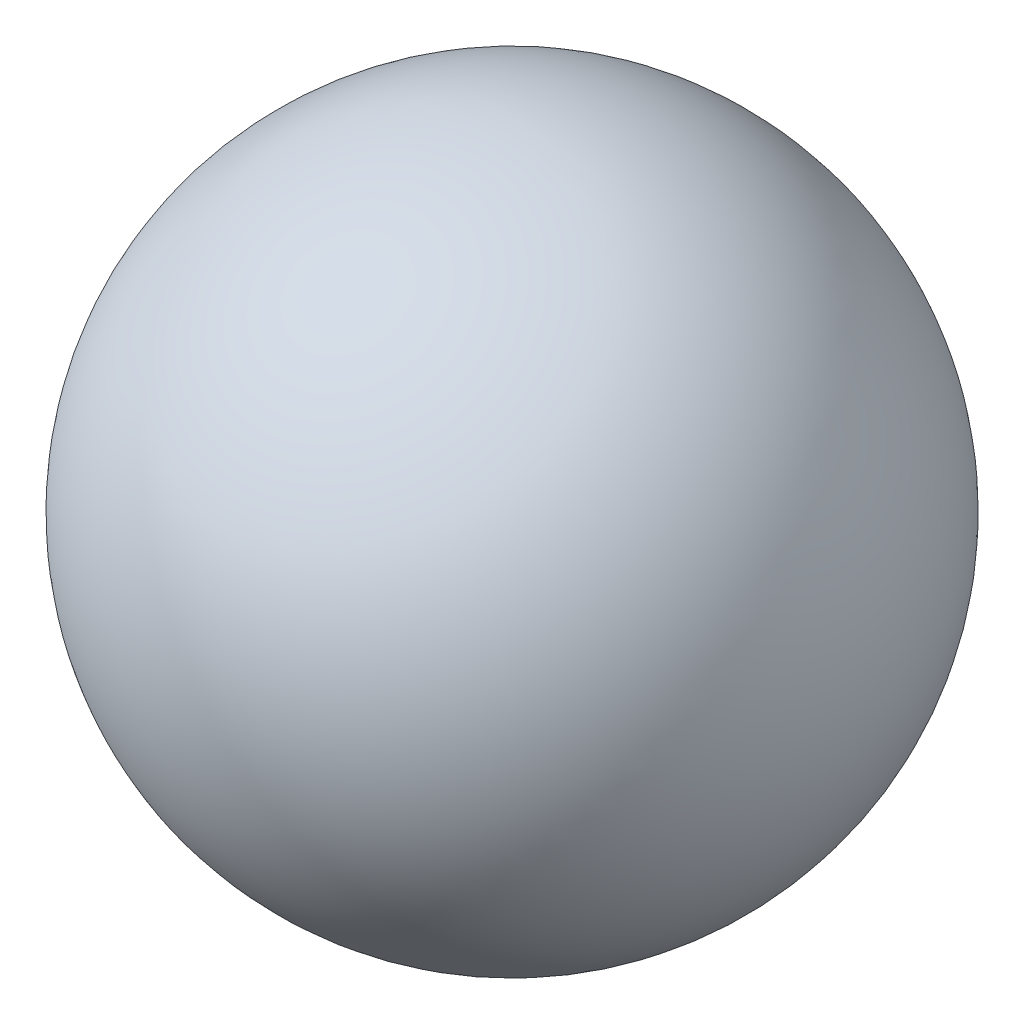
ISO-10303-21;
HEADER;
FILE_DESCRIPTION(('STEP AP214'),'2;1');
FILE_NAME('part.step','',(''),(''),'','','');
FILE_SCHEMA(('AUTOMOTIVE_DESIGN { 1 0 10303 214 1 1 1 1 }'));
ENDSEC;
DATA;
#1=APPLICATION_CONTEXT('core data for automotive mechanical design processes');
#2=APPLICATION_PROTOCOL_DEFINITION('international standard','automotive_design',2000,#1);
#3=PRODUCT_CONTEXT('',#1,'mechanical');
#4=PRODUCT('Part','Part','',(#3));
#5=PRODUCT_RELATED_PRODUCT_CATEGORY('part','',(#4));
#6=PRODUCT_DEFINITION_FORMATION('','',#4);
#7=PRODUCT_DEFINITION_CONTEXT('part definition',#1,'design');
#8=PRODUCT_DEFINITION('design','',#6,#7);
#9=PRODUCT_DEFINITION_SHAPE('','',#8);
#10=(LENGTH_UNIT() NAMED_UNIT(*) SI_UNIT(.MILLI.,.METRE.));
#11=(NAMED_UNIT(*) PLANE_ANGLE_UNIT() SI_UNIT($,.RADIAN.));
#12=(NAMED_UNIT(*) SI_UNIT($,.STERADIAN.) SOLID_ANGLE_UNIT());
#13=UNCERTAINTY_MEASURE_WITH_UNIT(LENGTH_MEASURE(1.E-05),#10,'distance_accuracy_value','');
#14=(GEOMETRIC_REPRESENTATION_CONTEXT(3) GLOBAL_UNCERTAINTY_ASSIGNED_CONTEXT((#13)) GLOBAL_UNIT_ASSIGNED_CONTEXT((#10,
#11,#12)) REPRESENTATION_CONTEXT('',''));
#15=CARTESIAN_POINT('',(0.,0.,0.));
#16=DIRECTION('',(0.,0.,1.));
#17=DIRECTION('',(1.,0.,0.));
#18=AXIS2_PLACEMENT_3D('',#15,#16,#17);
#19=CARTESIAN_POINT('',(0.,0.,0.));
#20=DIRECTION('',(0.,0.,1.));
#21=DIRECTION('',(-1.,0.,0.));
#22=AXIS2_PLACEMENT_3D('',#19,#20,#21);
#23=SPHERICAL_SURFACE('',#22,6.35);
#24=CARTESIAN_POINT('',(0.,0.,6.35));
#25=VERTEX_POINT('',#24);
#26=VERTEX_LOOP('',#25);
#27=FACE_BOUND('',#26,.T.);
#28=ADVANCED_FACE('F29',(#27),#23,.T.);
#29=CLOSED_SHELL('',(#28));
#30=MANIFOLD_SOLID_BREP('B2',#29);
#31=ADVANCED_BREP_SHAPE_REPRESENTATION('',(#18,#30),#14);
#32=SHAPE_DEFINITION_REPRESENTATION(#9,#31);
ENDSEC;
END-ISO-10303-21;
